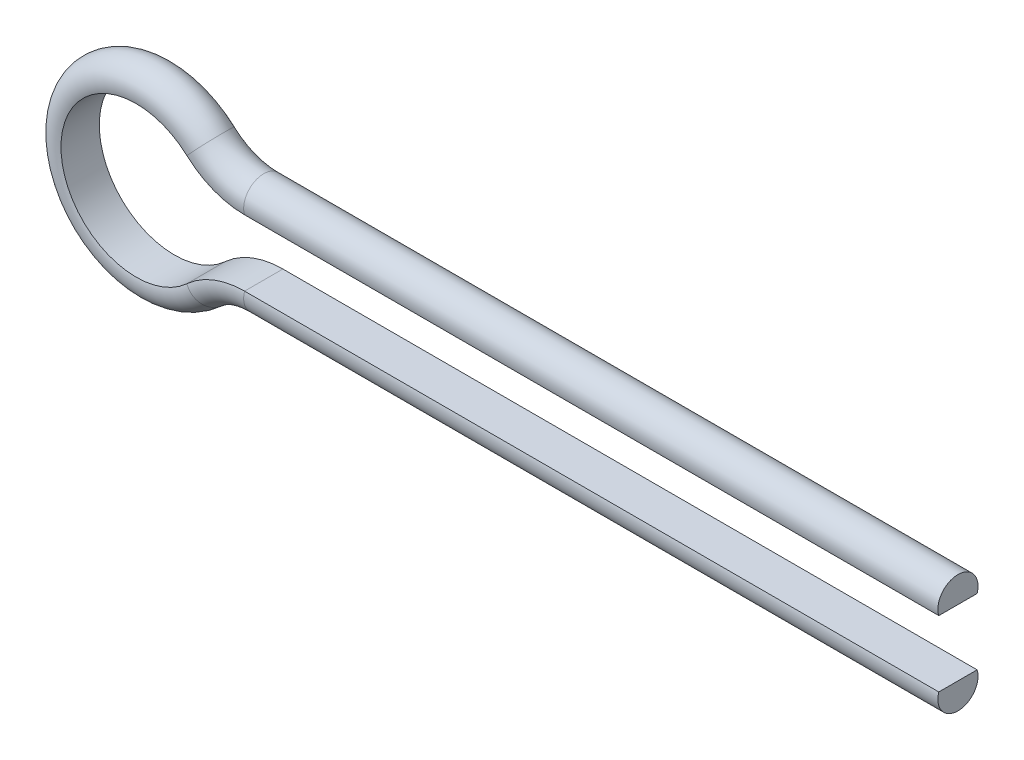
ISO-10303-21;
HEADER;
FILE_DESCRIPTION(('STEP AP214'),'2;1');
FILE_NAME('part.step','',(''),(''),'','','');
FILE_SCHEMA(('AUTOMOTIVE_DESIGN { 1 0 10303 214 1 1 1 1 }'));
ENDSEC;
DATA;
#1=APPLICATION_CONTEXT('core data for automotive mechanical design processes');
#2=APPLICATION_PROTOCOL_DEFINITION('international standard','automotive_design',2000,#1);
#3=PRODUCT_CONTEXT('',#1,'mechanical');
#4=PRODUCT('Part','Part','',(#3));
#5=PRODUCT_RELATED_PRODUCT_CATEGORY('part','',(#4));
#6=PRODUCT_DEFINITION_FORMATION('','',#4);
#7=PRODUCT_DEFINITION_CONTEXT('part definition',#1,'design');
#8=PRODUCT_DEFINITION('design','',#6,#7);
#9=PRODUCT_DEFINITION_SHAPE('','',#8);
#10=(LENGTH_UNIT() NAMED_UNIT(*) SI_UNIT(.MILLI.,.METRE.));
#11=(NAMED_UNIT(*) PLANE_ANGLE_UNIT() SI_UNIT($,.RADIAN.));
#12=(NAMED_UNIT(*) SI_UNIT($,.STERADIAN.) SOLID_ANGLE_UNIT());
#13=UNCERTAINTY_MEASURE_WITH_UNIT(LENGTH_MEASURE(1.E-05),#10,'distance_accuracy_value','');
#14=(GEOMETRIC_REPRESENTATION_CONTEXT(3) GLOBAL_UNCERTAINTY_ASSIGNED_CONTEXT((#13)) GLOBAL_UNIT_ASSIGNED_CONTEXT((#10,
#11,#12)) REPRESENTATION_CONTEXT('',''));
#15=CARTESIAN_POINT('',(0.,0.,0.));
#16=DIRECTION('',(0.,0.,1.));
#17=DIRECTION('',(1.,0.,0.));
#18=AXIS2_PLACEMENT_3D('',#15,#16,#17);
#19=CARTESIAN_POINT('',(100.,3.60896590082819,0.));
#20=DIRECTION('',(1.,0.,0.));
#21=DIRECTION('',(0.,0.,-1.));
#22=AXIS2_PLACEMENT_3D('',#19,#20,#21);
#23=PLANE('',#22);
#24=CARTESIAN_POINT('',(100.,3.60896590082819,0.));
#25=DIRECTION('',(1.,0.,0.));
#26=DIRECTION('',(0.,0.,-1.));
#27=AXIS2_PLACEMENT_3D('',#24,#25,#26);
#28=CIRCLE('',#27,2.5);
#29=CARTESIAN_POINT('',(100.,2.86629951923758,-2.38714194082696));
#30=VERTEX_POINT('',#29);
#31=CARTESIAN_POINT('',(100.,2.86629951923758,2.38714194082696));
#32=VERTEX_POINT('',#31);
#33=EDGE_CURVE('E91',#30,#32,#28,.T.);
#34=ORIENTED_EDGE('',*,*,#33,.T.);
#35=DIRECTION('',(0.,0.,-1.));
#36=VECTOR('',#35,1.);
#37=CARTESIAN_POINT('',(100.,2.86629951923758,2.38714194082696));
#38=LINE('',#37,#36);
#39=EDGE_CURVE('E101',#32,#30,#38,.T.);
#40=ORIENTED_EDGE('',*,*,#39,.T.);
#41=EDGE_LOOP('',(#34,#40));
#42=FACE_BOUND('',#41,.T.);
#43=ADVANCED_FACE('F39',(#42),#23,.T.);
#44=CARTESIAN_POINT('',(100.,-6.10896590082818,0.));
#45=DIRECTION('',(-1.,0.,0.));
#46=DIRECTION('',(0.,0.,-1.));
#47=AXIS2_PLACEMENT_3D('',#44,#45,#46);
#48=PLANE('',#47);
#49=CARTESIAN_POINT('',(100.,-6.10896590082818,0.));
#50=DIRECTION('',(-1.,0.,0.));
#51=DIRECTION('',(0.,0.,-1.));
#52=AXIS2_PLACEMENT_3D('',#49,#50,#51);
#53=CIRCLE('',#52,2.5);
#54=CARTESIAN_POINT('',(100.,-5.36629951923757,-2.38714194082696));
#55=VERTEX_POINT('',#54);
#56=CARTESIAN_POINT('',(100.,-5.36629951923757,2.38714194082696));
#57=VERTEX_POINT('',#56);
#58=EDGE_CURVE('E54',#55,#57,#53,.T.);
#59=ORIENTED_EDGE('',*,*,#58,.F.);
#60=DIRECTION('',(0.,0.,-1.));
#61=VECTOR('',#60,1.);
#62=CARTESIAN_POINT('',(100.,-5.36629951923757,2.38714194082696));
#63=LINE('',#62,#61);
#64=EDGE_CURVE('E11',#57,#55,#63,.T.);
#65=ORIENTED_EDGE('',*,*,#64,.F.);
#66=EDGE_LOOP('',(#59,#65));
#67=FACE_BOUND('',#66,.T.);
#68=ADVANCED_FACE('F211',(#67),#48,.F.);
#69=CARTESIAN_POINT('',(100.,3.60896590082819,0.));
#70=DIRECTION('',(-1.,0.,0.));
#71=DIRECTION('',(0.,0.,1.));
#72=AXIS2_PLACEMENT_3D('',#69,#70,#71);
#73=CYLINDRICAL_SURFACE('',#72,2.5);
#74=DIRECTION('',(-1.,0.,0.));
#75=VECTOR('',#74,1.);
#76=CARTESIAN_POINT('',(100.,2.86629951923758,2.38714194082696));
#77=LINE('',#76,#75);
#78=CARTESIAN_POINT('',(13.5069426592401,2.86629951923758,2.38714194082696));
#79=VERTEX_POINT('',#78);
#80=EDGE_CURVE('E98',#32,#79,#77,.T.);
#81=ORIENTED_EDGE('',*,*,#80,.F.);
#82=ORIENTED_EDGE('',*,*,#33,.F.);
#83=DIRECTION('',(-1.,0.,0.));
#84=VECTOR('',#83,1.);
#85=CARTESIAN_POINT('',(100.,2.86629951923758,-2.38714194082696));
#86=LINE('',#85,#84);
#87=CARTESIAN_POINT('',(13.5069426592401,2.86629951923758,-2.38714194082696));
#88=VERTEX_POINT('',#87);
#89=EDGE_CURVE('E96',#30,#88,#86,.T.);
#90=ORIENTED_EDGE('',*,*,#89,.T.);
#91=CARTESIAN_POINT('',(13.5069426592401,3.60896590082819,0.));
#92=DIRECTION('',(1.,0.,0.));
#93=DIRECTION('',(0.,0.,-1.));
#94=AXIS2_PLACEMENT_3D('',#91,#92,#93);
#95=CIRCLE('',#94,2.5);
#96=EDGE_CURVE('E112',#88,#79,#95,.T.);
#97=ORIENTED_EDGE('',*,*,#96,.T.);
#98=EDGE_LOOP('',(#81,#82,#90,#97));
#99=FACE_BOUND('',#98,.T.);
#100=ADVANCED_FACE('F93',(#99),#73,.T.);
#101=CARTESIAN_POINT('',(100.,2.86629951923758,2.38714194082696));
#102=DIRECTION('',(0.,1.,0.));
#103=DIRECTION('',(0.,0.,1.));
#104=AXIS2_PLACEMENT_3D('',#101,#102,#103);
#105=PLANE('',#104);
#106=DIRECTION('',(0.,0.,-1.));
#107=VECTOR('',#106,1.);
#108=CARTESIAN_POINT('',(13.5069426592401,2.86629951923758,2.38714194082696));
#109=LINE('',#108,#107);
#110=EDGE_CURVE('E109',#79,#88,#109,.T.);
#111=ORIENTED_EDGE('',*,*,#110,.T.);
#112=ORIENTED_EDGE('',*,*,#89,.F.);
#113=ORIENTED_EDGE('',*,*,#39,.F.);
#114=ORIENTED_EDGE('',*,*,#80,.T.);
#115=EDGE_LOOP('',(#111,#112,#113,#114));
#116=FACE_BOUND('',#115,.T.);
#117=ADVANCED_FACE('F107',(#116),#105,.F.);
#118=CARTESIAN_POINT('',(13.5069426592401,13.5,0.));
#119=DIRECTION('',(0.,0.,-1.));
#120=DIRECTION('',(-1.,0.,0.));
#121=AXIS2_PLACEMENT_3D('',#118,#119,#120);
#122=TOROIDAL_SURFACE('',#121,9.89103409917181,2.5);
#123=CARTESIAN_POINT('',(13.5069426592401,13.5,2.38714194082696));
#124=DIRECTION('',(0.,0.,-1.));
#125=DIRECTION('',(0.,-1.,0.));
#126=AXIS2_PLACEMENT_3D('',#123,#124,#125);
#127=CIRCLE('',#126,10.6337004807624);
#128=CARTESIAN_POINT('',(6.3255035267805,5.65764589543772,2.38714194082696));
#129=VERTEX_POINT('',#128);
#130=EDGE_CURVE('E122',#79,#129,#127,.T.);
#131=ORIENTED_EDGE('',*,*,#130,.F.);
#132=ORIENTED_EDGE('',*,*,#96,.F.);
#133=CARTESIAN_POINT('',(13.5069426592401,13.5,-2.38714194082696));
#134=DIRECTION('',(0.,0.,-1.));
#135=DIRECTION('',(0.,-1.,0.));
#136=AXIS2_PLACEMENT_3D('',#133,#134,#135);
#137=CIRCLE('',#136,10.6337004807624);
#138=CARTESIAN_POINT('',(6.3255035267805,5.65764589543772,-2.38714194082696));
#139=VERTEX_POINT('',#138);
#140=EDGE_CURVE('E123',#88,#139,#137,.T.);
#141=ORIENTED_EDGE('',*,*,#140,.T.);
#142=CARTESIAN_POINT('',(6.82706113833498,6.2053623518608,0.));
#143=DIRECTION('',(0.737499999999999,-0.675347132962006,0.));
#144=DIRECTION('',(0.,0.,-1.));
#145=AXIS2_PLACEMENT_3D('',#142,#143,#144);
#146=CIRCLE('',#145,2.5);
#147=EDGE_CURVE('E118',#139,#129,#146,.T.);
#148=ORIENTED_EDGE('',*,*,#147,.T.);
#149=EDGE_LOOP('',(#131,#132,#141,#148));
#150=FACE_BOUND('',#149,.T.);
#151=ADVANCED_FACE('F191',(#150),#122,.T.);
#152=CARTESIAN_POINT('',(13.5069426592401,13.5,0.));
#153=DIRECTION('',(0.,0.,-1.));
#154=DIRECTION('',(-1.,0.,0.));
#155=AXIS2_PLACEMENT_3D('',#152,#153,#154);
#156=CYLINDRICAL_SURFACE('',#155,10.6337004807624);
#157=DIRECTION('',(0.,0.,-1.));
#158=VECTOR('',#157,1.);
#159=CARTESIAN_POINT('',(6.3255035267805,5.65764589543773,2.38714194082696));
#160=LINE('',#159,#158);
#161=EDGE_CURVE('E127',#129,#139,#160,.T.);
#162=ORIENTED_EDGE('',*,*,#161,.T.);
#163=ORIENTED_EDGE('',*,*,#140,.F.);
#164=ORIENTED_EDGE('',*,*,#110,.F.);
#165=ORIENTED_EDGE('',*,*,#130,.T.);
#166=EDGE_LOOP('',(#162,#163,#164,#165));
#167=FACE_BOUND('',#166,.T.);
#168=ADVANCED_FACE('F189',(#167),#156,.T.);
#169=CARTESIAN_POINT('',(0.,-1.25,0.));
#170=DIRECTION('',(0.,0.,1.));
#171=DIRECTION('',(1.,0.,0.));
#172=AXIS2_PLACEMENT_3D('',#169,#170,#171);
#173=TOROIDAL_SURFACE('',#172,10.1089659008282,2.5);
#174=CARTESIAN_POINT('',(0.,-1.25,2.38714194082696));
#175=DIRECTION('',(0.,0.,1.));
#176=DIRECTION('',(0.675347132962004,0.737500000000001,0.));
#177=AXIS2_PLACEMENT_3D('',#174,#175,#176);
#178=CIRCLE('',#177,9.36629951923759);
#179=CARTESIAN_POINT('',(6.3255035267805,-8.15764589543773,2.38714194082696));
#180=VERTEX_POINT('',#179);
#181=EDGE_CURVE('E135',#129,#180,#178,.T.);
#182=ORIENTED_EDGE('',*,*,#181,.F.);
#183=ORIENTED_EDGE('',*,*,#147,.F.);
#184=CARTESIAN_POINT('',(0.,-1.25,-2.38714194082696));
#185=DIRECTION('',(0.,0.,1.));
#186=DIRECTION('',(0.675347132962004,0.737500000000001,0.));
#187=AXIS2_PLACEMENT_3D('',#184,#185,#186);
#188=CIRCLE('',#187,9.36629951923759);
#189=CARTESIAN_POINT('',(6.3255035267805,-8.15764589543773,-2.38714194082696));
#190=VERTEX_POINT('',#189);
#191=EDGE_CURVE('E136',#139,#190,#188,.T.);
#192=ORIENTED_EDGE('',*,*,#191,.T.);
#193=CARTESIAN_POINT('',(6.82706113833499,-8.70536235186079,0.));
#194=DIRECTION('',(-0.7375,-0.675347132962005,0.));
#195=DIRECTION('',(0.,0.,-1.));
#196=AXIS2_PLACEMENT_3D('',#193,#194,#195);
#197=CIRCLE('',#196,2.5);
#198=EDGE_CURVE('E131',#190,#180,#197,.T.);
#199=ORIENTED_EDGE('',*,*,#198,.T.);
#200=EDGE_LOOP('',(#182,#183,#192,#199));
#201=FACE_BOUND('',#200,.T.);
#202=ADVANCED_FACE('F184',(#201),#173,.T.);
#203=CARTESIAN_POINT('',(0.,-1.25,0.));
#204=DIRECTION('',(0.,0.,1.));
#205=DIRECTION('',(1.,0.,0.));
#206=AXIS2_PLACEMENT_3D('',#203,#204,#205);
#207=CYLINDRICAL_SURFACE('',#206,9.36629951923759);
#208=DIRECTION('',(0.,0.,-1.));
#209=VECTOR('',#208,1.);
#210=CARTESIAN_POINT('',(6.3255035267805,-8.15764589543772,2.38714194082696));
#211=LINE('',#210,#209);
#212=EDGE_CURVE('E140',#180,#190,#211,.T.);
#213=ORIENTED_EDGE('',*,*,#212,.T.);
#214=ORIENTED_EDGE('',*,*,#191,.F.);
#215=ORIENTED_EDGE('',*,*,#161,.F.);
#216=ORIENTED_EDGE('',*,*,#181,.T.);
#217=EDGE_LOOP('',(#213,#214,#215,#216));
#218=FACE_BOUND('',#217,.T.);
#219=ADVANCED_FACE('F187',(#218),#207,.F.);
#220=CARTESIAN_POINT('',(13.5069426592401,-16.,0.));
#221=DIRECTION('',(0.,0.,-1.));
#222=DIRECTION('',(-1.,0.,0.));
#223=AXIS2_PLACEMENT_3D('',#220,#221,#222);
#224=TOROIDAL_SURFACE('',#223,9.89103409917181,2.5);
#225=CARTESIAN_POINT('',(13.5069426592401,-16.,2.38714194082696));
#226=DIRECTION('',(0.,0.,-1.));
#227=DIRECTION('',(-0.675347132962006,0.737499999999999,0.));
#228=AXIS2_PLACEMENT_3D('',#225,#226,#227);
#229=CIRCLE('',#228,10.6337004807624);
#230=CARTESIAN_POINT('',(13.5069426592401,-5.36629951923758,2.38714194082696));
#231=VERTEX_POINT('',#230);
#232=EDGE_CURVE('E148',#180,#231,#229,.T.);
#233=ORIENTED_EDGE('',*,*,#232,.F.);
#234=ORIENTED_EDGE('',*,*,#198,.F.);
#235=CARTESIAN_POINT('',(13.5069426592401,-16.,-2.38714194082696));
#236=DIRECTION('',(0.,0.,-1.));
#237=DIRECTION('',(-0.675347132962006,0.737499999999999,0.));
#238=AXIS2_PLACEMENT_3D('',#235,#236,#237);
#239=CIRCLE('',#238,10.6337004807624);
#240=CARTESIAN_POINT('',(13.5069426592401,-5.36629951923758,-2.38714194082696));
#241=VERTEX_POINT('',#240);
#242=EDGE_CURVE('E149',#190,#241,#239,.T.);
#243=ORIENTED_EDGE('',*,*,#242,.T.);
#244=CARTESIAN_POINT('',(13.5069426592401,-6.10896590082819,0.));
#245=DIRECTION('',(-1.,0.,0.));
#246=DIRECTION('',(0.,0.,-1.));
#247=AXIS2_PLACEMENT_3D('',#244,#245,#246);
#248=CIRCLE('',#247,2.5);
#249=EDGE_CURVE('E144',#241,#231,#248,.T.);
#250=ORIENTED_EDGE('',*,*,#249,.T.);
#251=EDGE_LOOP('',(#233,#234,#243,#250));
#252=FACE_BOUND('',#251,.T.);
#253=ADVANCED_FACE('F181',(#252),#224,.T.);
#254=CARTESIAN_POINT('',(13.5069426592401,-16.,0.));
#255=DIRECTION('',(0.,0.,-1.));
#256=DIRECTION('',(-1.,0.,0.));
#257=AXIS2_PLACEMENT_3D('',#254,#255,#256);
#258=CYLINDRICAL_SURFACE('',#257,10.6337004807624);
#259=DIRECTION('',(0.,0.,-1.));
#260=VECTOR('',#259,1.);
#261=CARTESIAN_POINT('',(13.5069426592401,-5.36629951923758,2.38714194082696));
#262=LINE('',#261,#260);
#263=EDGE_CURVE('E153',#231,#241,#262,.T.);
#264=ORIENTED_EDGE('',*,*,#263,.T.);
#265=ORIENTED_EDGE('',*,*,#242,.F.);
#266=ORIENTED_EDGE('',*,*,#212,.F.);
#267=ORIENTED_EDGE('',*,*,#232,.T.);
#268=EDGE_LOOP('',(#264,#265,#266,#267));
#269=FACE_BOUND('',#268,.T.);
#270=ADVANCED_FACE('F176',(#269),#258,.T.);
#271=CARTESIAN_POINT('',(13.5069426592401,-6.10896590082819,0.));
#272=DIRECTION('',(1.,0.,0.));
#273=DIRECTION('',(0.,1.,0.));
#274=AXIS2_PLACEMENT_3D('',#271,#272,#273);
#275=CYLINDRICAL_SURFACE('',#274,2.5);
#276=DIRECTION('',(1.,0.,0.));
#277=VECTOR('',#276,1.);
#278=CARTESIAN_POINT('',(13.5069426592401,-5.36629951923758,2.38714194082696));
#279=LINE('',#278,#277);
#280=EDGE_CURVE('E47',#231,#57,#279,.T.);
#281=ORIENTED_EDGE('',*,*,#280,.F.);
#282=ORIENTED_EDGE('',*,*,#249,.F.);
#283=DIRECTION('',(1.,0.,0.));
#284=VECTOR('',#283,1.);
#285=CARTESIAN_POINT('',(13.5069426592401,-5.36629951923758,-2.38714194082696));
#286=LINE('',#285,#284);
#287=EDGE_CURVE('E159',#241,#55,#286,.T.);
#288=ORIENTED_EDGE('',*,*,#287,.T.);
#289=ORIENTED_EDGE('',*,*,#58,.T.);
#290=EDGE_LOOP('',(#281,#282,#288,#289));
#291=FACE_BOUND('',#290,.T.);
#292=ADVANCED_FACE('F178',(#291),#275,.T.);
#293=CARTESIAN_POINT('',(13.5069426592401,-5.36629951923758,2.38714194082696));
#294=DIRECTION('',(0.,-1.,0.));
#295=DIRECTION('',(1.,0.,0.));
#296=AXIS2_PLACEMENT_3D('',#293,#294,#295);
#297=PLANE('',#296);
#298=ORIENTED_EDGE('',*,*,#64,.T.);
#299=ORIENTED_EDGE('',*,*,#287,.F.);
#300=ORIENTED_EDGE('',*,*,#263,.F.);
#301=ORIENTED_EDGE('',*,*,#280,.T.);
#302=EDGE_LOOP('',(#298,#299,#300,#301));
#303=FACE_BOUND('',#302,.T.);
#304=ADVANCED_FACE('F202',(#303),#297,.F.);
#305=CLOSED_SHELL('',(#43,#68,#100,#117,#151,#168,#202,#219,#253,#270,#292,#304));
#306=MANIFOLD_SOLID_BREP('B2',#305);
#307=ADVANCED_BREP_SHAPE_REPRESENTATION('',(#18,#306),#14);
#308=SHAPE_DEFINITION_REPRESENTATION(#9,#307);
ENDSEC;
END-ISO-10303-21;
